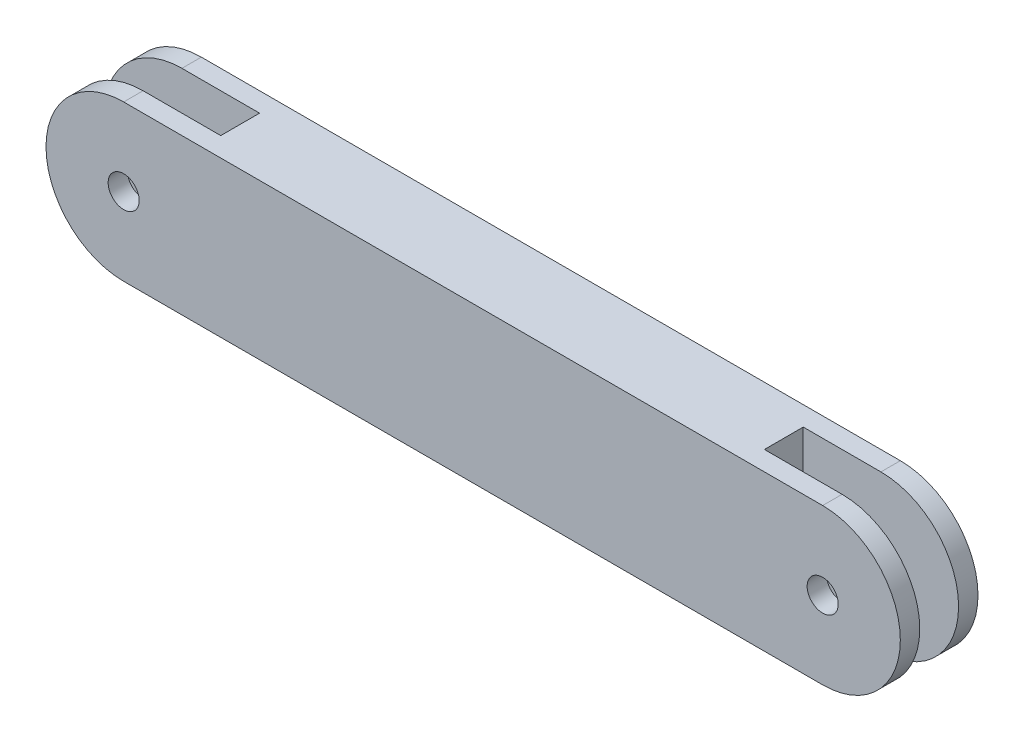
ISO-10303-21;
HEADER;
FILE_DESCRIPTION(('STEP AP214'),'2;1');
FILE_NAME('part.step','',(''),(''),'','','');
FILE_SCHEMA(('AUTOMOTIVE_DESIGN { 1 0 10303 214 1 1 1 1 }'));
ENDSEC;
DATA;
#1=APPLICATION_CONTEXT('core data for automotive mechanical design processes');
#2=APPLICATION_PROTOCOL_DEFINITION('international standard','automotive_design',2000,#1);
#3=PRODUCT_CONTEXT('',#1,'mechanical');
#4=PRODUCT('Part','Part','',(#3));
#5=PRODUCT_RELATED_PRODUCT_CATEGORY('part','',(#4));
#6=PRODUCT_DEFINITION_FORMATION('','',#4);
#7=PRODUCT_DEFINITION_CONTEXT('part definition',#1,'design');
#8=PRODUCT_DEFINITION('design','',#6,#7);
#9=PRODUCT_DEFINITION_SHAPE('','',#8);
#10=(LENGTH_UNIT() NAMED_UNIT(*) SI_UNIT(.MILLI.,.METRE.));
#11=(NAMED_UNIT(*) PLANE_ANGLE_UNIT() SI_UNIT($,.RADIAN.));
#12=(NAMED_UNIT(*) SI_UNIT($,.STERADIAN.) SOLID_ANGLE_UNIT());
#13=UNCERTAINTY_MEASURE_WITH_UNIT(LENGTH_MEASURE(1.E-05),#10,'distance_accuracy_value','');
#14=(GEOMETRIC_REPRESENTATION_CONTEXT(3) GLOBAL_UNCERTAINTY_ASSIGNED_CONTEXT((#13)) GLOBAL_UNIT_ASSIGNED_CONTEXT((#10,
#11,#12)) REPRESENTATION_CONTEXT('',''));
#15=CARTESIAN_POINT('',(0.,0.,0.));
#16=DIRECTION('',(0.,0.,1.));
#17=DIRECTION('',(1.,0.,0.));
#18=AXIS2_PLACEMENT_3D('',#15,#16,#17);
#19=CARTESIAN_POINT('',(180.,0.,20.));
#20=DIRECTION('',(0.,0.,-1.));
#21=DIRECTION('',(-1.,0.,0.));
#22=AXIS2_PLACEMENT_3D('',#19,#20,#21);
#23=CYLINDRICAL_SURFACE('',#22,20.);
#24=DIRECTION('',(0.,0.,-1.));
#25=VECTOR('',#24,1.);
#26=CARTESIAN_POINT('',(180.,20.,20.));
#27=LINE('',#26,#25);
#28=CARTESIAN_POINT('',(180.,20.,5.));
#29=VERTEX_POINT('',#28);
#30=CARTESIAN_POINT('',(180.,20.,0.));
#31=VERTEX_POINT('',#30);
#32=EDGE_CURVE('E228',#29,#31,#27,.T.);
#33=ORIENTED_EDGE('',*,*,#32,.F.);
#34=CARTESIAN_POINT('',(180.,0.,4.99999999999999));
#35=DIRECTION('',(0.,0.,-1.));
#36=DIRECTION('',(0.,1.,0.));
#37=AXIS2_PLACEMENT_3D('',#34,#35,#36);
#38=CIRCLE('',#37,20.);
#39=CARTESIAN_POINT('',(180.,-20.,4.99999999999998));
#40=VERTEX_POINT('',#39);
#41=EDGE_CURVE('E56',#29,#40,#38,.T.);
#42=ORIENTED_EDGE('',*,*,#41,.T.);
#43=DIRECTION('',(0.,0.,-1.));
#44=VECTOR('',#43,1.);
#45=CARTESIAN_POINT('',(180.,-20.,20.));
#46=LINE('',#45,#44);
#47=CARTESIAN_POINT('',(180.,-20.,0.));
#48=VERTEX_POINT('',#47);
#49=EDGE_CURVE('E230',#40,#48,#46,.T.);
#50=ORIENTED_EDGE('',*,*,#49,.T.);
#51=CARTESIAN_POINT('',(180.,0.,0.));
#52=DIRECTION('',(0.,0.,1.));
#53=DIRECTION('',(1.,0.,0.));
#54=AXIS2_PLACEMENT_3D('',#51,#52,#53);
#55=CIRCLE('',#54,20.);
#56=EDGE_CURVE('E220',#48,#31,#55,.T.);
#57=ORIENTED_EDGE('',*,*,#56,.T.);
#58=EDGE_LOOP('',(#33,#42,#50,#57));
#59=FACE_BOUND('',#58,.T.);
#60=ADVANCED_FACE('F39',(#59),#23,.T.);
#61=CARTESIAN_POINT('',(180.,0.,20.));
#62=DIRECTION('',(0.,0.,-1.));
#63=DIRECTION('',(-1.,0.,0.));
#64=AXIS2_PLACEMENT_3D('',#61,#62,#63);
#65=CYLINDRICAL_SURFACE('',#64,3.99999999999999);
#66=CARTESIAN_POINT('',(180.,0.,15.));
#67=DIRECTION('',(0.,0.,1.));
#68=DIRECTION('',(0.,-1.,0.));
#69=AXIS2_PLACEMENT_3D('',#66,#67,#68);
#70=CIRCLE('',#69,3.99999999999999);
#71=CARTESIAN_POINT('',(180.,-3.99999999999999,15.));
#72=VERTEX_POINT('',#71);
#73=EDGE_CURVE('E43',#72,#72,#70,.T.);
#74=ORIENTED_EDGE('',*,*,#73,.F.);
#75=EDGE_LOOP('',(#74));
#76=FACE_BOUND('',#75,.T.);
#77=CARTESIAN_POINT('',(180.,0.,20.));
#78=DIRECTION('',(0.,0.,1.));
#79=DIRECTION('',(1.,0.,0.));
#80=AXIS2_PLACEMENT_3D('',#77,#78,#79);
#81=CIRCLE('',#80,3.99999999999999);
#82=CARTESIAN_POINT('',(184.,0.,20.));
#83=VERTEX_POINT('',#82);
#84=EDGE_CURVE('E192',#83,#83,#81,.T.);
#85=ORIENTED_EDGE('',*,*,#84,.T.);
#86=EDGE_LOOP('',(#85));
#87=FACE_BOUND('',#86,.T.);
#88=ADVANCED_FACE('F297',(#76,#87),#65,.F.);
#89=CARTESIAN_POINT('',(0.,0.,20.));
#90=DIRECTION('',(0.,0.,-1.));
#91=DIRECTION('',(-1.,0.,0.));
#92=AXIS2_PLACEMENT_3D('',#89,#90,#91);
#93=CYLINDRICAL_SURFACE('',#92,20.);
#94=CARTESIAN_POINT('',(0.,0.,15.));
#95=DIRECTION('',(0.,0.,-1.));
#96=DIRECTION('',(0.,1.,0.));
#97=AXIS2_PLACEMENT_3D('',#94,#95,#96);
#98=CIRCLE('',#97,20.);
#99=CARTESIAN_POINT('',(0.,-20.,15.));
#100=VERTEX_POINT('',#99);
#101=CARTESIAN_POINT('',(0.,20.,15.));
#102=VERTEX_POINT('',#101);
#103=EDGE_CURVE('E189',#100,#102,#98,.T.);
#104=ORIENTED_EDGE('',*,*,#103,.F.);
#105=DIRECTION('',(0.,0.,-1.));
#106=VECTOR('',#105,1.);
#107=CARTESIAN_POINT('',(0.,-20.,20.));
#108=LINE('',#107,#106);
#109=CARTESIAN_POINT('',(0.,-20.,20.));
#110=VERTEX_POINT('',#109);
#111=EDGE_CURVE('E11',#110,#100,#108,.T.);
#112=ORIENTED_EDGE('',*,*,#111,.F.);
#113=CARTESIAN_POINT('',(0.,0.,20.));
#114=DIRECTION('',(0.,0.,1.));
#115=DIRECTION('',(1.,0.,0.));
#116=AXIS2_PLACEMENT_3D('',#113,#114,#115);
#117=CIRCLE('',#116,20.);
#118=CARTESIAN_POINT('',(0.,20.,20.));
#119=VERTEX_POINT('',#118);
#120=EDGE_CURVE('E204',#119,#110,#117,.T.);
#121=ORIENTED_EDGE('',*,*,#120,.F.);
#122=DIRECTION('',(0.,0.,-1.));
#123=VECTOR('',#122,1.);
#124=CARTESIAN_POINT('',(0.,20.,20.));
#125=LINE('',#124,#123);
#126=EDGE_CURVE('E225',#119,#102,#125,.T.);
#127=ORIENTED_EDGE('',*,*,#126,.T.);
#128=EDGE_LOOP('',(#104,#112,#121,#127));
#129=FACE_BOUND('',#128,.T.);
#130=ADVANCED_FACE('F41',(#129),#93,.T.);
#131=CARTESIAN_POINT('',(0.,0.,4.99999999999999));
#132=DIRECTION('',(0.,0.,1.));
#133=DIRECTION('',(0.,-1.,0.));
#134=AXIS2_PLACEMENT_3D('',#131,#132,#133);
#135=CIRCLE('',#134,20.);
#136=CARTESIAN_POINT('',(0.,20.,5.));
#137=VERTEX_POINT('',#136);
#138=CARTESIAN_POINT('',(0.,-20.,4.99999999999998));
#139=VERTEX_POINT('',#138);
#140=EDGE_CURVE('E186',#137,#139,#135,.T.);
#141=ORIENTED_EDGE('',*,*,#140,.F.);
#142=CARTESIAN_POINT('',(0.,20.,0.));
#143=VERTEX_POINT('',#142);
#144=EDGE_CURVE('E214',#137,#143,#125,.T.);
#145=ORIENTED_EDGE('',*,*,#144,.T.);
#146=CARTESIAN_POINT('',(0.,0.,0.));
#147=DIRECTION('',(0.,0.,1.));
#148=DIRECTION('',(1.,0.,0.));
#149=AXIS2_PLACEMENT_3D('',#146,#147,#148);
#150=CIRCLE('',#149,20.);
#151=CARTESIAN_POINT('',(0.,-20.,0.));
#152=VERTEX_POINT('',#151);
#153=EDGE_CURVE('E201',#143,#152,#150,.T.);
#154=ORIENTED_EDGE('',*,*,#153,.T.);
#155=EDGE_CURVE('E48',#139,#152,#108,.T.);
#156=ORIENTED_EDGE('',*,*,#155,.F.);
#157=EDGE_LOOP('',(#141,#145,#154,#156));
#158=FACE_BOUND('',#157,.T.);
#159=ADVANCED_FACE('F281',(#158),#93,.T.);
#160=CARTESIAN_POINT('',(0.,-20.,20.));
#161=DIRECTION('',(0.,1.,0.));
#162=DIRECTION('',(0.,0.,1.));
#163=AXIS2_PLACEMENT_3D('',#160,#161,#162);
#164=PLANE('',#163);
#165=DIRECTION('',(0.,0.,-1.));
#166=VECTOR('',#165,1.);
#167=CARTESIAN_POINT('',(160.,-20.,15.));
#168=LINE('',#167,#166);
#169=CARTESIAN_POINT('',(160.,-20.,15.));
#170=VERTEX_POINT('',#169);
#171=CARTESIAN_POINT('',(160.,-20.,4.99999999999998));
#172=VERTEX_POINT('',#171);
#173=EDGE_CURVE('E264',#170,#172,#168,.T.);
#174=ORIENTED_EDGE('',*,*,#173,.F.);
#175=DIRECTION('',(1.,0.,0.));
#176=VECTOR('',#175,1.);
#177=CARTESIAN_POINT('',(160.,-20.,15.));
#178=LINE('',#177,#176);
#179=CARTESIAN_POINT('',(180.,-20.,15.));
#180=VERTEX_POINT('',#179);
#181=EDGE_CURVE('E138',#170,#180,#178,.T.);
#182=ORIENTED_EDGE('',*,*,#181,.T.);
#183=CARTESIAN_POINT('',(180.,-20.,20.));
#184=VERTEX_POINT('',#183);
#185=EDGE_CURVE('E231',#184,#180,#46,.T.);
#186=ORIENTED_EDGE('',*,*,#185,.F.);
#187=DIRECTION('',(1.,0.,0.));
#188=VECTOR('',#187,1.);
#189=CARTESIAN_POINT('',(0.,-20.,20.));
#190=LINE('',#189,#188);
#191=EDGE_CURVE('E207',#110,#184,#190,.T.);
#192=ORIENTED_EDGE('',*,*,#191,.F.);
#193=ORIENTED_EDGE('',*,*,#111,.T.);
#194=DIRECTION('',(-1.,0.,0.));
#195=VECTOR('',#194,1.);
#196=CARTESIAN_POINT('',(20.,-20.,15.));
#197=LINE('',#196,#195);
#198=CARTESIAN_POINT('',(20.,-20.,15.));
#199=VERTEX_POINT('',#198);
#200=EDGE_CURVE('E183',#199,#100,#197,.T.);
#201=ORIENTED_EDGE('',*,*,#200,.F.);
#202=DIRECTION('',(0.,0.,-1.));
#203=VECTOR('',#202,1.);
#204=CARTESIAN_POINT('',(20.,-20.,15.));
#205=LINE('',#204,#203);
#206=CARTESIAN_POINT('',(20.,-20.,4.99999999999998));
#207=VERTEX_POINT('',#206);
#208=EDGE_CURVE('E167',#199,#207,#205,.T.);
#209=ORIENTED_EDGE('',*,*,#208,.T.);
#210=DIRECTION('',(-1.,0.,0.));
#211=VECTOR('',#210,1.);
#212=CARTESIAN_POINT('',(20.,-20.,4.99999999999998));
#213=LINE('',#212,#211);
#214=EDGE_CURVE('E180',#207,#139,#213,.T.);
#215=ORIENTED_EDGE('',*,*,#214,.T.);
#216=ORIENTED_EDGE('',*,*,#155,.T.);
#217=DIRECTION('',(1.,0.,0.));
#218=VECTOR('',#217,1.);
#219=CARTESIAN_POINT('',(0.,-20.,0.));
#220=LINE('',#219,#218);
#221=EDGE_CURVE('E217',#152,#48,#220,.T.);
#222=ORIENTED_EDGE('',*,*,#221,.T.);
#223=ORIENTED_EDGE('',*,*,#49,.F.);
#224=DIRECTION('',(1.,0.,0.));
#225=VECTOR('',#224,1.);
#226=CARTESIAN_POINT('',(160.,-20.,4.99999999999998));
#227=LINE('',#226,#225);
#228=EDGE_CURVE('E159',#172,#40,#227,.T.);
#229=ORIENTED_EDGE('',*,*,#228,.F.);
#230=EDGE_LOOP('',(#174,#182,#186,#192,#193,#201,#209,#215,#216,#222,#223,#229));
#231=FACE_BOUND('',#230,.T.);
#232=ADVANCED_FACE('F262',(#231),#164,.F.);
#233=CARTESIAN_POINT('',(0.,20.,20.));
#234=DIRECTION('',(0.,-1.,0.));
#235=DIRECTION('',(0.,0.,-1.));
#236=AXIS2_PLACEMENT_3D('',#233,#234,#235);
#237=PLANE('',#236);
#238=CARTESIAN_POINT('',(180.,20.,20.));
#239=VERTEX_POINT('',#238);
#240=CARTESIAN_POINT('',(180.,20.,15.));
#241=VERTEX_POINT('',#240);
#242=EDGE_CURVE('E154',#239,#241,#27,.T.);
#243=ORIENTED_EDGE('',*,*,#242,.T.);
#244=DIRECTION('',(1.,0.,0.));
#245=VECTOR('',#244,1.);
#246=CARTESIAN_POINT('',(160.,20.,15.));
#247=LINE('',#246,#245);
#248=CARTESIAN_POINT('',(160.,20.,15.));
#249=VERTEX_POINT('',#248);
#250=EDGE_CURVE('E135',#249,#241,#247,.T.);
#251=ORIENTED_EDGE('',*,*,#250,.F.);
#252=DIRECTION('',(0.,0.,1.));
#253=VECTOR('',#252,1.);
#254=CARTESIAN_POINT('',(160.,20.,15.));
#255=LINE('',#254,#253);
#256=CARTESIAN_POINT('',(160.,20.,5.));
#257=VERTEX_POINT('',#256);
#258=EDGE_CURVE('E142',#257,#249,#255,.T.);
#259=ORIENTED_EDGE('',*,*,#258,.F.);
#260=DIRECTION('',(1.,0.,0.));
#261=VECTOR('',#260,1.);
#262=CARTESIAN_POINT('',(160.,20.,5.));
#263=LINE('',#262,#261);
#264=EDGE_CURVE('E156',#257,#29,#263,.T.);
#265=ORIENTED_EDGE('',*,*,#264,.T.);
#266=ORIENTED_EDGE('',*,*,#32,.T.);
#267=DIRECTION('',(-1.,0.,0.));
#268=VECTOR('',#267,1.);
#269=CARTESIAN_POINT('',(0.,20.,0.));
#270=LINE('',#269,#268);
#271=EDGE_CURVE('E208',#31,#143,#270,.T.);
#272=ORIENTED_EDGE('',*,*,#271,.T.);
#273=ORIENTED_EDGE('',*,*,#144,.F.);
#274=DIRECTION('',(-1.,0.,0.));
#275=VECTOR('',#274,1.);
#276=CARTESIAN_POINT('',(20.,20.,5.));
#277=LINE('',#276,#275);
#278=CARTESIAN_POINT('',(20.,20.,5.));
#279=VERTEX_POINT('',#278);
#280=EDGE_CURVE('E178',#279,#137,#277,.T.);
#281=ORIENTED_EDGE('',*,*,#280,.F.);
#282=DIRECTION('',(0.,0.,1.));
#283=VECTOR('',#282,1.);
#284=CARTESIAN_POINT('',(20.,20.,15.));
#285=LINE('',#284,#283);
#286=CARTESIAN_POINT('',(20.,20.,15.));
#287=VERTEX_POINT('',#286);
#288=EDGE_CURVE('E172',#279,#287,#285,.T.);
#289=ORIENTED_EDGE('',*,*,#288,.T.);
#290=DIRECTION('',(-1.,0.,0.));
#291=VECTOR('',#290,1.);
#292=CARTESIAN_POINT('',(20.,20.,15.));
#293=LINE('',#292,#291);
#294=EDGE_CURVE('E175',#287,#102,#293,.T.);
#295=ORIENTED_EDGE('',*,*,#294,.T.);
#296=ORIENTED_EDGE('',*,*,#126,.F.);
#297=DIRECTION('',(-1.,0.,0.));
#298=VECTOR('',#297,1.);
#299=CARTESIAN_POINT('',(0.,20.,20.));
#300=LINE('',#299,#298);
#301=EDGE_CURVE('E212',#239,#119,#300,.T.);
#302=ORIENTED_EDGE('',*,*,#301,.F.);
#303=EDGE_LOOP('',(#243,#251,#259,#265,#266,#272,#273,#281,#289,#295,#296,#302));
#304=FACE_BOUND('',#303,.T.);
#305=ADVANCED_FACE('F151',(#304),#237,.F.);
#306=CARTESIAN_POINT('',(0.,0.,20.));
#307=DIRECTION('',(0.,0.,-1.));
#308=DIRECTION('',(-1.,0.,0.));
#309=AXIS2_PLACEMENT_3D('',#306,#307,#308);
#310=CYLINDRICAL_SURFACE('',#309,4.);
#311=CARTESIAN_POINT('',(0.,0.,20.));
#312=DIRECTION('',(0.,0.,1.));
#313=DIRECTION('',(1.,0.,0.));
#314=AXIS2_PLACEMENT_3D('',#311,#312,#313);
#315=CIRCLE('',#314,4.);
#316=CARTESIAN_POINT('',(4.,0.,20.));
#317=VERTEX_POINT('',#316);
#318=EDGE_CURVE('E198',#317,#317,#315,.T.);
#319=ORIENTED_EDGE('',*,*,#318,.T.);
#320=EDGE_LOOP('',(#319));
#321=FACE_BOUND('',#320,.T.);
#322=CARTESIAN_POINT('',(0.,0.,15.));
#323=DIRECTION('',(0.,0.,-1.));
#324=DIRECTION('',(0.,1.,0.));
#325=AXIS2_PLACEMENT_3D('',#322,#323,#324);
#326=CIRCLE('',#325,4.);
#327=CARTESIAN_POINT('',(0.,4.,15.));
#328=VERTEX_POINT('',#327);
#329=EDGE_CURVE('E188',#328,#328,#326,.T.);
#330=ORIENTED_EDGE('',*,*,#329,.T.);
#331=EDGE_LOOP('',(#330));
#332=FACE_BOUND('',#331,.T.);
#333=ADVANCED_FACE('F239',(#321,#332),#310,.F.);
#334=CARTESIAN_POINT('',(0.,0.,0.));
#335=DIRECTION('',(0.,0.,1.));
#336=DIRECTION('',(1.,0.,0.));
#337=AXIS2_PLACEMENT_3D('',#334,#335,#336);
#338=CIRCLE('',#337,4.);
#339=CARTESIAN_POINT('',(4.,0.,0.));
#340=VERTEX_POINT('',#339);
#341=EDGE_CURVE('E195',#340,#340,#338,.T.);
#342=ORIENTED_EDGE('',*,*,#341,.F.);
#343=EDGE_LOOP('',(#342));
#344=FACE_BOUND('',#343,.T.);
#345=CARTESIAN_POINT('',(0.,0.,4.99999999999999));
#346=DIRECTION('',(0.,0.,1.));
#347=DIRECTION('',(0.,-1.,0.));
#348=AXIS2_PLACEMENT_3D('',#345,#346,#347);
#349=CIRCLE('',#348,4.);
#350=CARTESIAN_POINT('',(0.,-4.,4.99999999999999));
#351=VERTEX_POINT('',#350);
#352=EDGE_CURVE('E185',#351,#351,#349,.T.);
#353=ORIENTED_EDGE('',*,*,#352,.T.);
#354=EDGE_LOOP('',(#353));
#355=FACE_BOUND('',#354,.T.);
#356=ADVANCED_FACE('F315',(#344,#355),#310,.F.);
#357=CARTESIAN_POINT('',(0.,0.,20.));
#358=DIRECTION('',(0.,0.,1.));
#359=DIRECTION('',(1.,0.,0.));
#360=AXIS2_PLACEMENT_3D('',#357,#358,#359);
#361=PLANE('',#360);
#362=ORIENTED_EDGE('',*,*,#318,.F.);
#363=EDGE_LOOP('',(#362));
#364=FACE_BOUND('',#363,.T.);
#365=ORIENTED_EDGE('',*,*,#120,.T.);
#366=ORIENTED_EDGE('',*,*,#191,.T.);
#367=CARTESIAN_POINT('',(180.,0.,20.));
#368=DIRECTION('',(0.,0.,1.));
#369=DIRECTION('',(1.,0.,0.));
#370=AXIS2_PLACEMENT_3D('',#367,#368,#369);
#371=CIRCLE('',#370,20.);
#372=EDGE_CURVE('E210',#184,#239,#371,.T.);
#373=ORIENTED_EDGE('',*,*,#372,.T.);
#374=ORIENTED_EDGE('',*,*,#301,.T.);
#375=EDGE_LOOP('',(#365,#366,#373,#374));
#376=FACE_BOUND('',#375,.T.);
#377=ORIENTED_EDGE('',*,*,#84,.F.);
#378=EDGE_LOOP('',(#377));
#379=FACE_BOUND('',#378,.T.);
#380=ADVANCED_FACE('F255',(#364,#376,#379),#361,.T.);
#381=CARTESIAN_POINT('',(0.,0.,0.));
#382=DIRECTION('',(0.,0.,1.));
#383=DIRECTION('',(1.,0.,0.));
#384=AXIS2_PLACEMENT_3D('',#381,#382,#383);
#385=PLANE('',#384);
#386=ORIENTED_EDGE('',*,*,#153,.F.);
#387=ORIENTED_EDGE('',*,*,#271,.F.);
#388=ORIENTED_EDGE('',*,*,#56,.F.);
#389=ORIENTED_EDGE('',*,*,#221,.F.);
#390=EDGE_LOOP('',(#386,#387,#388,#389));
#391=FACE_BOUND('',#390,.T.);
#392=ORIENTED_EDGE('',*,*,#341,.T.);
#393=EDGE_LOOP('',(#392));
#394=FACE_BOUND('',#393,.T.);
#395=CARTESIAN_POINT('',(180.,0.,0.));
#396=DIRECTION('',(0.,0.,1.));
#397=DIRECTION('',(1.,0.,0.));
#398=AXIS2_PLACEMENT_3D('',#395,#396,#397);
#399=CIRCLE('',#398,3.99999999999999);
#400=CARTESIAN_POINT('',(184.,0.,0.));
#401=VERTEX_POINT('',#400);
#402=EDGE_CURVE('E191',#401,#401,#399,.T.);
#403=ORIENTED_EDGE('',*,*,#402,.T.);
#404=EDGE_LOOP('',(#403));
#405=FACE_BOUND('',#404,.T.);
#406=ADVANCED_FACE('F276',(#391,#394,#405),#385,.F.);
#407=ORIENTED_EDGE('',*,*,#185,.T.);
#408=CARTESIAN_POINT('',(180.,0.,15.));
#409=DIRECTION('',(0.,0.,1.));
#410=DIRECTION('',(0.,-1.,0.));
#411=AXIS2_PLACEMENT_3D('',#408,#409,#410);
#412=CIRCLE('',#411,20.);
#413=EDGE_CURVE('E164',#180,#241,#412,.T.);
#414=ORIENTED_EDGE('',*,*,#413,.T.);
#415=ORIENTED_EDGE('',*,*,#242,.F.);
#416=ORIENTED_EDGE('',*,*,#372,.F.);
#417=EDGE_LOOP('',(#407,#414,#415,#416));
#418=FACE_BOUND('',#417,.T.);
#419=ADVANCED_FACE('F260',(#418),#23,.T.);
#420=CARTESIAN_POINT('',(180.,0.,4.99999999999999));
#421=DIRECTION('',(0.,0.,-1.));
#422=DIRECTION('',(0.,1.,0.));
#423=AXIS2_PLACEMENT_3D('',#420,#421,#422);
#424=CIRCLE('',#423,3.99999999999999);
#425=CARTESIAN_POINT('',(180.,3.99999999999999,4.99999999999999));
#426=VERTEX_POINT('',#425);
#427=EDGE_CURVE('E155',#426,#426,#424,.T.);
#428=ORIENTED_EDGE('',*,*,#427,.F.);
#429=EDGE_LOOP('',(#428));
#430=FACE_BOUND('',#429,.T.);
#431=ORIENTED_EDGE('',*,*,#402,.F.);
#432=EDGE_LOOP('',(#431));
#433=FACE_BOUND('',#432,.T.);
#434=ADVANCED_FACE('F245',(#430,#433),#65,.F.);
#435=CARTESIAN_POINT('',(20.,20.,15.));
#436=DIRECTION('',(0.,0.,-1.));
#437=DIRECTION('',(0.,1.,0.));
#438=AXIS2_PLACEMENT_3D('',#435,#436,#437);
#439=PLANE('',#438);
#440=ORIENTED_EDGE('',*,*,#329,.F.);
#441=EDGE_LOOP('',(#440));
#442=FACE_BOUND('',#441,.T.);
#443=ORIENTED_EDGE('',*,*,#103,.T.);
#444=ORIENTED_EDGE('',*,*,#294,.F.);
#445=DIRECTION('',(0.,-1.,0.));
#446=VECTOR('',#445,1.);
#447=CARTESIAN_POINT('',(20.,20.,15.));
#448=LINE('',#447,#446);
#449=EDGE_CURVE('E64',#287,#199,#448,.T.);
#450=ORIENTED_EDGE('',*,*,#449,.T.);
#451=ORIENTED_EDGE('',*,*,#200,.T.);
#452=EDGE_LOOP('',(#443,#444,#450,#451));
#453=FACE_BOUND('',#452,.T.);
#454=ADVANCED_FACE('F241',(#442,#453),#439,.T.);
#455=CARTESIAN_POINT('',(20.,20.,5.));
#456=DIRECTION('',(0.,0.,1.));
#457=DIRECTION('',(0.,-1.,0.));
#458=AXIS2_PLACEMENT_3D('',#455,#456,#457);
#459=PLANE('',#458);
#460=ORIENTED_EDGE('',*,*,#352,.F.);
#461=EDGE_LOOP('',(#460));
#462=FACE_BOUND('',#461,.T.);
#463=ORIENTED_EDGE('',*,*,#140,.T.);
#464=ORIENTED_EDGE('',*,*,#214,.F.);
#465=DIRECTION('',(0.,1.,0.));
#466=VECTOR('',#465,1.);
#467=CARTESIAN_POINT('',(20.,20.,5.));
#468=LINE('',#467,#466);
#469=EDGE_CURVE('E170',#207,#279,#468,.T.);
#470=ORIENTED_EDGE('',*,*,#469,.T.);
#471=ORIENTED_EDGE('',*,*,#280,.T.);
#472=EDGE_LOOP('',(#463,#464,#470,#471));
#473=FACE_BOUND('',#472,.T.);
#474=ADVANCED_FACE('F244',(#462,#473),#459,.T.);
#475=CARTESIAN_POINT('',(20.,0.,0.));
#476=DIRECTION('',(1.,0.,0.));
#477=DIRECTION('',(0.,0.,-1.));
#478=AXIS2_PLACEMENT_3D('',#475,#476,#477);
#479=PLANE('',#478);
#480=ORIENTED_EDGE('',*,*,#449,.F.);
#481=ORIENTED_EDGE('',*,*,#288,.F.);
#482=ORIENTED_EDGE('',*,*,#469,.F.);
#483=ORIENTED_EDGE('',*,*,#208,.F.);
#484=EDGE_LOOP('',(#480,#481,#482,#483));
#485=FACE_BOUND('',#484,.T.);
#486=ADVANCED_FACE('F285',(#485),#479,.F.);
#487=CARTESIAN_POINT('',(160.,20.,15.));
#488=DIRECTION('',(0.,0.,1.));
#489=DIRECTION('',(0.,-1.,0.));
#490=AXIS2_PLACEMENT_3D('',#487,#488,#489);
#491=PLANE('',#490);
#492=ORIENTED_EDGE('',*,*,#73,.T.);
#493=EDGE_LOOP('',(#492));
#494=FACE_BOUND('',#493,.T.);
#495=ORIENTED_EDGE('',*,*,#181,.F.);
#496=DIRECTION('',(0.,-1.,0.));
#497=VECTOR('',#496,1.);
#498=CARTESIAN_POINT('',(160.,20.,15.));
#499=LINE('',#498,#497);
#500=EDGE_CURVE('E131',#249,#170,#499,.T.);
#501=ORIENTED_EDGE('',*,*,#500,.F.);
#502=ORIENTED_EDGE('',*,*,#250,.T.);
#503=ORIENTED_EDGE('',*,*,#413,.F.);
#504=EDGE_LOOP('',(#495,#501,#502,#503));
#505=FACE_BOUND('',#504,.T.);
#506=ADVANCED_FACE('F133',(#494,#505),#491,.F.);
#507=CARTESIAN_POINT('',(160.,20.,5.));
#508=DIRECTION('',(0.,0.,-1.));
#509=DIRECTION('',(0.,1.,0.));
#510=AXIS2_PLACEMENT_3D('',#507,#508,#509);
#511=PLANE('',#510);
#512=ORIENTED_EDGE('',*,*,#427,.T.);
#513=EDGE_LOOP('',(#512));
#514=FACE_BOUND('',#513,.T.);
#515=ORIENTED_EDGE('',*,*,#264,.F.);
#516=DIRECTION('',(0.,1.,0.));
#517=VECTOR('',#516,1.);
#518=CARTESIAN_POINT('',(160.,20.,5.));
#519=LINE('',#518,#517);
#520=EDGE_CURVE('E147',#172,#257,#519,.T.);
#521=ORIENTED_EDGE('',*,*,#520,.F.);
#522=ORIENTED_EDGE('',*,*,#228,.T.);
#523=ORIENTED_EDGE('',*,*,#41,.F.);
#524=EDGE_LOOP('',(#515,#521,#522,#523));
#525=FACE_BOUND('',#524,.T.);
#526=ADVANCED_FACE('F270',(#514,#525),#511,.F.);
#527=CARTESIAN_POINT('',(160.,0.,0.));
#528=DIRECTION('',(-1.,0.,0.));
#529=DIRECTION('',(0.,0.,-1.));
#530=AXIS2_PLACEMENT_3D('',#527,#528,#529);
#531=PLANE('',#530);
#532=ORIENTED_EDGE('',*,*,#500,.T.);
#533=ORIENTED_EDGE('',*,*,#173,.T.);
#534=ORIENTED_EDGE('',*,*,#520,.T.);
#535=ORIENTED_EDGE('',*,*,#258,.T.);
#536=EDGE_LOOP('',(#532,#533,#534,#535));
#537=FACE_BOUND('',#536,.T.);
#538=ADVANCED_FACE('F146',(#537),#531,.F.);
#539=CLOSED_SHELL('',(#60,#88,#130,#159,#232,#305,#333,#356,#380,#406,#419,#434,#454,#474,#486,
#506,#526,#538));
#540=MANIFOLD_SOLID_BREP('B2',#539);
#541=ADVANCED_BREP_SHAPE_REPRESENTATION('',(#18,#540),#14);
#542=SHAPE_DEFINITION_REPRESENTATION(#9,#541);
ENDSEC;
END-ISO-10303-21;
